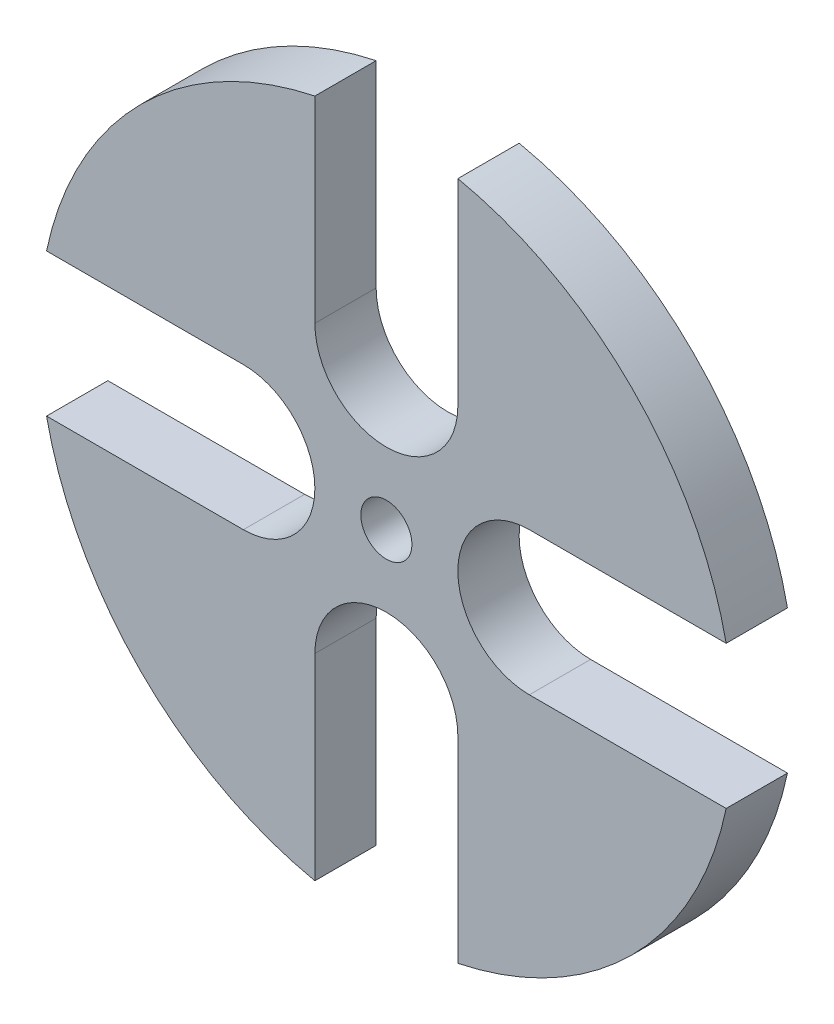
ISO-10303-21;
HEADER;
FILE_DESCRIPTION(('STEP AP214'),'2;1');
FILE_NAME('part.step','',(''),(''),'','','');
FILE_SCHEMA(('AUTOMOTIVE_DESIGN { 1 0 10303 214 1 1 1 1 }'));
ENDSEC;
DATA;
#1=APPLICATION_CONTEXT('core data for automotive mechanical design processes');
#2=APPLICATION_PROTOCOL_DEFINITION('international standard','automotive_design',2000,#1);
#3=PRODUCT_CONTEXT('',#1,'mechanical');
#4=PRODUCT('Part','Part','',(#3));
#5=PRODUCT_RELATED_PRODUCT_CATEGORY('part','',(#4));
#6=PRODUCT_DEFINITION_FORMATION('','',#4);
#7=PRODUCT_DEFINITION_CONTEXT('part definition',#1,'design');
#8=PRODUCT_DEFINITION('design','',#6,#7);
#9=PRODUCT_DEFINITION_SHAPE('','',#8);
#10=(LENGTH_UNIT() NAMED_UNIT(*) SI_UNIT(.MILLI.,.METRE.));
#11=(NAMED_UNIT(*) PLANE_ANGLE_UNIT() SI_UNIT($,.RADIAN.));
#12=(NAMED_UNIT(*) SI_UNIT($,.STERADIAN.) SOLID_ANGLE_UNIT());
#13=UNCERTAINTY_MEASURE_WITH_UNIT(LENGTH_MEASURE(1.E-05),#10,'distance_accuracy_value','');
#14=(GEOMETRIC_REPRESENTATION_CONTEXT(3) GLOBAL_UNCERTAINTY_ASSIGNED_CONTEXT((#13)) GLOBAL_UNIT_ASSIGNED_CONTEXT((#10,
#11,#12)) REPRESENTATION_CONTEXT('',''));
#15=CARTESIAN_POINT('',(0.,0.,0.));
#16=DIRECTION('',(0.,0.,1.));
#17=DIRECTION('',(1.,0.,0.));
#18=AXIS2_PLACEMENT_3D('',#15,#16,#17);
#19=CARTESIAN_POINT('',(0.,-7.,3.));
#20=DIRECTION('',(0.,0.,-1.));
#21=DIRECTION('',(-1.,0.,0.));
#22=AXIS2_PLACEMENT_3D('',#19,#20,#21);
#23=CYLINDRICAL_SURFACE('',#22,3.5);
#24=CARTESIAN_POINT('',(0.,-7.,0.));
#25=DIRECTION('',(0.,0.,1.));
#26=DIRECTION('',(1.,0.,0.));
#27=AXIS2_PLACEMENT_3D('',#24,#25,#26);
#28=CIRCLE('',#27,3.5);
#29=CARTESIAN_POINT('',(3.5,-7.,0.));
#30=VERTEX_POINT('',#29);
#31=CARTESIAN_POINT('',(-3.5,-7.,0.));
#32=VERTEX_POINT('',#31);
#33=EDGE_CURVE('E217',#30,#32,#28,.T.);
#34=ORIENTED_EDGE('',*,*,#33,.F.);
#35=DIRECTION('',(0.,0.,-1.));
#36=VECTOR('',#35,1.);
#37=CARTESIAN_POINT('',(3.5,-7.,3.));
#38=LINE('',#37,#36);
#39=CARTESIAN_POINT('',(3.5,-7.,3.));
#40=VERTEX_POINT('',#39);
#41=EDGE_CURVE('E11',#40,#30,#38,.T.);
#42=ORIENTED_EDGE('',*,*,#41,.F.);
#43=CARTESIAN_POINT('',(0.,-7.,3.));
#44=DIRECTION('',(0.,0.,1.));
#45=DIRECTION('',(1.,0.,0.));
#46=AXIS2_PLACEMENT_3D('',#43,#44,#45);
#47=CIRCLE('',#46,3.5);
#48=CARTESIAN_POINT('',(-3.5,-7.,3.));
#49=VERTEX_POINT('',#48);
#50=EDGE_CURVE('E320',#40,#49,#47,.T.);
#51=ORIENTED_EDGE('',*,*,#50,.T.);
#52=DIRECTION('',(0.,0.,-1.));
#53=VECTOR('',#52,1.);
#54=CARTESIAN_POINT('',(-3.5,-7.,3.));
#55=LINE('',#54,#53);
#56=EDGE_CURVE('E52',#49,#32,#55,.T.);
#57=ORIENTED_EDGE('',*,*,#56,.T.);
#58=EDGE_LOOP('',(#34,#42,#51,#57));
#59=FACE_BOUND('',#58,.T.);
#60=ADVANCED_FACE('F35',(#59),#23,.F.);
#61=CARTESIAN_POINT('',(3.5,0.,3.));
#62=DIRECTION('',(1.,0.,0.));
#63=DIRECTION('',(0.,0.,-1.));
#64=AXIS2_PLACEMENT_3D('',#61,#62,#63);
#65=PLANE('',#64);
#66=DIRECTION('',(0.,-1.,0.));
#67=VECTOR('',#66,1.);
#68=CARTESIAN_POINT('',(3.5,0.,0.));
#69=LINE('',#68,#67);
#70=CARTESIAN_POINT('',(3.5,-16.6358047596141,0.));
#71=VERTEX_POINT('',#70);
#72=EDGE_CURVE('E214',#30,#71,#69,.T.);
#73=ORIENTED_EDGE('',*,*,#72,.T.);
#74=DIRECTION('',(0.,0.,-1.));
#75=VECTOR('',#74,1.);
#76=CARTESIAN_POINT('',(3.5,-16.6358047596141,3.));
#77=LINE('',#76,#75);
#78=CARTESIAN_POINT('',(3.5,-16.6358047596141,3.));
#79=VERTEX_POINT('',#78);
#80=EDGE_CURVE('E44',#79,#71,#77,.T.);
#81=ORIENTED_EDGE('',*,*,#80,.F.);
#82=DIRECTION('',(0.,-1.,0.));
#83=VECTOR('',#82,1.);
#84=CARTESIAN_POINT('',(3.5,0.,3.));
#85=LINE('',#84,#83);
#86=EDGE_CURVE('E322',#40,#79,#85,.T.);
#87=ORIENTED_EDGE('',*,*,#86,.F.);
#88=ORIENTED_EDGE('',*,*,#41,.T.);
#89=EDGE_LOOP('',(#73,#81,#87,#88));
#90=FACE_BOUND('',#89,.T.);
#91=ADVANCED_FACE('F215',(#90),#65,.F.);
#92=CARTESIAN_POINT('',(0.,0.,3.));
#93=DIRECTION('',(0.,0.,-1.));
#94=DIRECTION('',(-1.,0.,0.));
#95=AXIS2_PLACEMENT_3D('',#92,#93,#94);
#96=CYLINDRICAL_SURFACE('',#95,17.);
#97=CARTESIAN_POINT('',(0.,0.,0.));
#98=DIRECTION('',(0.,0.,1.));
#99=DIRECTION('',(1.,0.,0.));
#100=AXIS2_PLACEMENT_3D('',#97,#98,#99);
#101=CIRCLE('',#100,17.);
#102=CARTESIAN_POINT('',(16.6358047596141,-3.5,0.));
#103=VERTEX_POINT('',#102);
#104=EDGE_CURVE('E209',#71,#103,#101,.T.);
#105=ORIENTED_EDGE('',*,*,#104,.T.);
#106=DIRECTION('',(0.,0.,-1.));
#107=VECTOR('',#106,1.);
#108=CARTESIAN_POINT('',(16.6358047596141,-3.5,3.));
#109=LINE('',#108,#107);
#110=CARTESIAN_POINT('',(16.6358047596141,-3.5,3.));
#111=VERTEX_POINT('',#110);
#112=EDGE_CURVE('E201',#111,#103,#109,.T.);
#113=ORIENTED_EDGE('',*,*,#112,.F.);
#114=CARTESIAN_POINT('',(0.,0.,3.));
#115=DIRECTION('',(0.,0.,1.));
#116=DIRECTION('',(1.,0.,0.));
#117=AXIS2_PLACEMENT_3D('',#114,#115,#116);
#118=CIRCLE('',#117,17.);
#119=EDGE_CURVE('E162',#79,#111,#118,.T.);
#120=ORIENTED_EDGE('',*,*,#119,.F.);
#121=ORIENTED_EDGE('',*,*,#80,.T.);
#122=EDGE_LOOP('',(#105,#113,#120,#121));
#123=FACE_BOUND('',#122,.T.);
#124=ADVANCED_FACE('F207',(#123),#96,.T.);
#125=CARTESIAN_POINT('',(0.,-3.5,3.));
#126=DIRECTION('',(0.,1.,0.));
#127=DIRECTION('',(0.,0.,1.));
#128=AXIS2_PLACEMENT_3D('',#125,#126,#127);
#129=PLANE('',#128);
#130=DIRECTION('',(1.,0.,0.));
#131=VECTOR('',#130,1.);
#132=CARTESIAN_POINT('',(0.,-3.5,0.));
#133=LINE('',#132,#131);
#134=CARTESIAN_POINT('',(7.,-3.5,0.));
#135=VERTEX_POINT('',#134);
#136=EDGE_CURVE('E219',#135,#103,#133,.T.);
#137=ORIENTED_EDGE('',*,*,#136,.F.);
#138=DIRECTION('',(0.,0.,-1.));
#139=VECTOR('',#138,1.);
#140=CARTESIAN_POINT('',(7.,-3.5,3.));
#141=LINE('',#140,#139);
#142=CARTESIAN_POINT('',(7.,-3.5,3.));
#143=VERTEX_POINT('',#142);
#144=EDGE_CURVE('E199',#143,#135,#141,.T.);
#145=ORIENTED_EDGE('',*,*,#144,.F.);
#146=DIRECTION('',(1.,0.,0.));
#147=VECTOR('',#146,1.);
#148=CARTESIAN_POINT('',(0.,-3.5,3.));
#149=LINE('',#148,#147);
#150=EDGE_CURVE('E326',#143,#111,#149,.T.);
#151=ORIENTED_EDGE('',*,*,#150,.T.);
#152=ORIENTED_EDGE('',*,*,#112,.T.);
#153=EDGE_LOOP('',(#137,#145,#151,#152));
#154=FACE_BOUND('',#153,.T.);
#155=ADVANCED_FACE('F278',(#154),#129,.T.);
#156=CARTESIAN_POINT('',(7.,0.,3.));
#157=DIRECTION('',(0.,0.,-1.));
#158=DIRECTION('',(-1.,0.,0.));
#159=AXIS2_PLACEMENT_3D('',#156,#157,#158);
#160=CYLINDRICAL_SURFACE('',#159,3.5);
#161=CARTESIAN_POINT('',(7.,0.,0.));
#162=DIRECTION('',(0.,0.,1.));
#163=DIRECTION('',(1.,0.,0.));
#164=AXIS2_PLACEMENT_3D('',#161,#162,#163);
#165=CIRCLE('',#164,3.5);
#166=CARTESIAN_POINT('',(7.,3.5,0.));
#167=VERTEX_POINT('',#166);
#168=EDGE_CURVE('E228',#167,#135,#165,.T.);
#169=ORIENTED_EDGE('',*,*,#168,.F.);
#170=DIRECTION('',(0.,0.,-1.));
#171=VECTOR('',#170,1.);
#172=CARTESIAN_POINT('',(7.,3.5,3.));
#173=LINE('',#172,#171);
#174=CARTESIAN_POINT('',(7.,3.5,3.));
#175=VERTEX_POINT('',#174);
#176=EDGE_CURVE('E197',#175,#167,#173,.T.);
#177=ORIENTED_EDGE('',*,*,#176,.F.);
#178=CARTESIAN_POINT('',(7.,0.,3.));
#179=DIRECTION('',(0.,0.,1.));
#180=DIRECTION('',(1.,0.,0.));
#181=AXIS2_PLACEMENT_3D('',#178,#179,#180);
#182=CIRCLE('',#181,3.5);
#183=EDGE_CURVE('E330',#175,#143,#182,.T.);
#184=ORIENTED_EDGE('',*,*,#183,.T.);
#185=ORIENTED_EDGE('',*,*,#144,.T.);
#186=EDGE_LOOP('',(#169,#177,#184,#185));
#187=FACE_BOUND('',#186,.T.);
#188=ADVANCED_FACE('F281',(#187),#160,.F.);
#189=CARTESIAN_POINT('',(0.,3.5,3.));
#190=DIRECTION('',(0.,1.,0.));
#191=DIRECTION('',(0.,0.,1.));
#192=AXIS2_PLACEMENT_3D('',#189,#190,#191);
#193=PLANE('',#192);
#194=DIRECTION('',(1.,0.,0.));
#195=VECTOR('',#194,1.);
#196=CARTESIAN_POINT('',(0.,3.5,0.));
#197=LINE('',#196,#195);
#198=CARTESIAN_POINT('',(16.6358047596141,3.5,0.));
#199=VERTEX_POINT('',#198);
#200=EDGE_CURVE('E231',#167,#199,#197,.T.);
#201=ORIENTED_EDGE('',*,*,#200,.T.);
#202=DIRECTION('',(0.,0.,-1.));
#203=VECTOR('',#202,1.);
#204=CARTESIAN_POINT('',(16.6358047596141,3.5,3.));
#205=LINE('',#204,#203);
#206=CARTESIAN_POINT('',(16.6358047596141,3.5,3.));
#207=VERTEX_POINT('',#206);
#208=EDGE_CURVE('E194',#207,#199,#205,.T.);
#209=ORIENTED_EDGE('',*,*,#208,.F.);
#210=DIRECTION('',(1.,0.,0.));
#211=VECTOR('',#210,1.);
#212=CARTESIAN_POINT('',(0.,3.5,3.));
#213=LINE('',#212,#211);
#214=EDGE_CURVE('E333',#175,#207,#213,.T.);
#215=ORIENTED_EDGE('',*,*,#214,.F.);
#216=ORIENTED_EDGE('',*,*,#176,.T.);
#217=EDGE_LOOP('',(#201,#209,#215,#216));
#218=FACE_BOUND('',#217,.T.);
#219=ADVANCED_FACE('F285',(#218),#193,.F.);
#220=CARTESIAN_POINT('',(3.5,16.6358047596141,0.));
#221=VERTEX_POINT('',#220);
#222=EDGE_CURVE('E222',#199,#221,#101,.T.);
#223=ORIENTED_EDGE('',*,*,#222,.T.);
#224=DIRECTION('',(0.,0.,-1.));
#225=VECTOR('',#224,1.);
#226=CARTESIAN_POINT('',(3.5,16.6358047596141,3.));
#227=LINE('',#226,#225);
#228=CARTESIAN_POINT('',(3.5,16.6358047596141,3.));
#229=VERTEX_POINT('',#228);
#230=EDGE_CURVE('E192',#229,#221,#227,.T.);
#231=ORIENTED_EDGE('',*,*,#230,.F.);
#232=EDGE_CURVE('E327',#207,#229,#118,.T.);
#233=ORIENTED_EDGE('',*,*,#232,.F.);
#234=ORIENTED_EDGE('',*,*,#208,.T.);
#235=EDGE_LOOP('',(#223,#231,#233,#234));
#236=FACE_BOUND('',#235,.T.);
#237=ADVANCED_FACE('F289',(#236),#96,.T.);
#238=CARTESIAN_POINT('',(3.5,0.,3.));
#239=DIRECTION('',(-1.,0.,0.));
#240=DIRECTION('',(0.,0.,1.));
#241=AXIS2_PLACEMENT_3D('',#238,#239,#240);
#242=PLANE('',#241);
#243=DIRECTION('',(0.,1.,0.));
#244=VECTOR('',#243,1.);
#245=CARTESIAN_POINT('',(3.5,0.,0.));
#246=LINE('',#245,#244);
#247=CARTESIAN_POINT('',(3.5,7.,0.));
#248=VERTEX_POINT('',#247);
#249=EDGE_CURVE('E234',#248,#221,#246,.T.);
#250=ORIENTED_EDGE('',*,*,#249,.F.);
#251=DIRECTION('',(0.,0.,-1.));
#252=VECTOR('',#251,1.);
#253=CARTESIAN_POINT('',(3.5,7.,3.));
#254=LINE('',#253,#252);
#255=CARTESIAN_POINT('',(3.5,7.,3.));
#256=VERTEX_POINT('',#255);
#257=EDGE_CURVE('E190',#256,#248,#254,.T.);
#258=ORIENTED_EDGE('',*,*,#257,.F.);
#259=DIRECTION('',(0.,1.,0.));
#260=VECTOR('',#259,1.);
#261=CARTESIAN_POINT('',(3.5,0.,3.));
#262=LINE('',#261,#260);
#263=EDGE_CURVE('E336',#256,#229,#262,.T.);
#264=ORIENTED_EDGE('',*,*,#263,.T.);
#265=ORIENTED_EDGE('',*,*,#230,.T.);
#266=EDGE_LOOP('',(#250,#258,#264,#265));
#267=FACE_BOUND('',#266,.T.);
#268=ADVANCED_FACE('F291',(#267),#242,.T.);
#269=CARTESIAN_POINT('',(0.,7.,3.));
#270=DIRECTION('',(0.,0.,-1.));
#271=DIRECTION('',(-1.,0.,0.));
#272=AXIS2_PLACEMENT_3D('',#269,#270,#271);
#273=CYLINDRICAL_SURFACE('',#272,3.5);
#274=CARTESIAN_POINT('',(0.,7.,0.));
#275=DIRECTION('',(0.,0.,1.));
#276=DIRECTION('',(1.,0.,0.));
#277=AXIS2_PLACEMENT_3D('',#274,#275,#276);
#278=CIRCLE('',#277,3.5);
#279=CARTESIAN_POINT('',(-3.5,7.,0.));
#280=VERTEX_POINT('',#279);
#281=EDGE_CURVE('E237',#280,#248,#278,.T.);
#282=ORIENTED_EDGE('',*,*,#281,.F.);
#283=DIRECTION('',(0.,0.,-1.));
#284=VECTOR('',#283,1.);
#285=CARTESIAN_POINT('',(-3.5,7.,3.));
#286=LINE('',#285,#284);
#287=CARTESIAN_POINT('',(-3.5,7.,3.));
#288=VERTEX_POINT('',#287);
#289=EDGE_CURVE('E188',#288,#280,#286,.T.);
#290=ORIENTED_EDGE('',*,*,#289,.F.);
#291=CARTESIAN_POINT('',(0.,7.,3.));
#292=DIRECTION('',(0.,0.,1.));
#293=DIRECTION('',(1.,0.,0.));
#294=AXIS2_PLACEMENT_3D('',#291,#292,#293);
#295=CIRCLE('',#294,3.5);
#296=EDGE_CURVE('E339',#288,#256,#295,.T.);
#297=ORIENTED_EDGE('',*,*,#296,.T.);
#298=ORIENTED_EDGE('',*,*,#257,.T.);
#299=EDGE_LOOP('',(#282,#290,#297,#298));
#300=FACE_BOUND('',#299,.T.);
#301=ADVANCED_FACE('F294',(#300),#273,.F.);
#302=CARTESIAN_POINT('',(-3.5,0.,3.));
#303=DIRECTION('',(-1.,0.,0.));
#304=DIRECTION('',(0.,0.,1.));
#305=AXIS2_PLACEMENT_3D('',#302,#303,#304);
#306=PLANE('',#305);
#307=DIRECTION('',(0.,1.,0.));
#308=VECTOR('',#307,1.);
#309=CARTESIAN_POINT('',(-3.5,0.,0.));
#310=LINE('',#309,#308);
#311=CARTESIAN_POINT('',(-3.5,16.6358047596141,0.));
#312=VERTEX_POINT('',#311);
#313=EDGE_CURVE('E240',#280,#312,#310,.T.);
#314=ORIENTED_EDGE('',*,*,#313,.T.);
#315=DIRECTION('',(0.,0.,-1.));
#316=VECTOR('',#315,1.);
#317=CARTESIAN_POINT('',(-3.5,16.6358047596141,3.));
#318=LINE('',#317,#316);
#319=CARTESIAN_POINT('',(-3.5,16.6358047596141,3.));
#320=VERTEX_POINT('',#319);
#321=EDGE_CURVE('E185',#320,#312,#318,.T.);
#322=ORIENTED_EDGE('',*,*,#321,.F.);
#323=DIRECTION('',(0.,1.,0.));
#324=VECTOR('',#323,1.);
#325=CARTESIAN_POINT('',(-3.5,0.,3.));
#326=LINE('',#325,#324);
#327=EDGE_CURVE('E342',#288,#320,#326,.T.);
#328=ORIENTED_EDGE('',*,*,#327,.F.);
#329=ORIENTED_EDGE('',*,*,#289,.T.);
#330=EDGE_LOOP('',(#314,#322,#328,#329));
#331=FACE_BOUND('',#330,.T.);
#332=ADVANCED_FACE('F298',(#331),#306,.F.);
#333=CARTESIAN_POINT('',(-16.6358047596141,3.5,0.));
#334=VERTEX_POINT('',#333);
#335=EDGE_CURVE('E243',#312,#334,#101,.T.);
#336=ORIENTED_EDGE('',*,*,#335,.T.);
#337=DIRECTION('',(0.,0.,-1.));
#338=VECTOR('',#337,1.);
#339=CARTESIAN_POINT('',(-16.6358047596141,3.5,3.));
#340=LINE('',#339,#338);
#341=CARTESIAN_POINT('',(-16.6358047596141,3.5,3.));
#342=VERTEX_POINT('',#341);
#343=EDGE_CURVE('E183',#342,#334,#340,.T.);
#344=ORIENTED_EDGE('',*,*,#343,.F.);
#345=EDGE_CURVE('E161',#320,#342,#118,.T.);
#346=ORIENTED_EDGE('',*,*,#345,.F.);
#347=ORIENTED_EDGE('',*,*,#321,.T.);
#348=EDGE_LOOP('',(#336,#344,#346,#347));
#349=FACE_BOUND('',#348,.T.);
#350=ADVANCED_FACE('F270',(#349),#96,.T.);
#351=CARTESIAN_POINT('',(0.,3.5,3.));
#352=DIRECTION('',(0.,-1.,0.));
#353=DIRECTION('',(1.,0.,0.));
#354=AXIS2_PLACEMENT_3D('',#351,#352,#353);
#355=PLANE('',#354);
#356=DIRECTION('',(-1.,0.,0.));
#357=VECTOR('',#356,1.);
#358=CARTESIAN_POINT('',(0.,3.5,0.));
#359=LINE('',#358,#357);
#360=CARTESIAN_POINT('',(-7.,3.5,0.));
#361=VERTEX_POINT('',#360);
#362=EDGE_CURVE('E244',#361,#334,#359,.T.);
#363=ORIENTED_EDGE('',*,*,#362,.F.);
#364=DIRECTION('',(0.,0.,-1.));
#365=VECTOR('',#364,1.);
#366=CARTESIAN_POINT('',(-7.,3.5,3.));
#367=LINE('',#366,#365);
#368=CARTESIAN_POINT('',(-7.,3.5,3.));
#369=VERTEX_POINT('',#368);
#370=EDGE_CURVE('E177',#369,#361,#367,.T.);
#371=ORIENTED_EDGE('',*,*,#370,.F.);
#372=DIRECTION('',(-1.,0.,0.));
#373=VECTOR('',#372,1.);
#374=CARTESIAN_POINT('',(0.,3.5,3.));
#375=LINE('',#374,#373);
#376=EDGE_CURVE('E345',#369,#342,#375,.T.);
#377=ORIENTED_EDGE('',*,*,#376,.T.);
#378=ORIENTED_EDGE('',*,*,#343,.T.);
#379=EDGE_LOOP('',(#363,#371,#377,#378));
#380=FACE_BOUND('',#379,.T.);
#381=ADVANCED_FACE('F303',(#380),#355,.T.);
#382=CARTESIAN_POINT('',(-7.,0.,3.));
#383=DIRECTION('',(0.,0.,-1.));
#384=DIRECTION('',(-1.,0.,0.));
#385=AXIS2_PLACEMENT_3D('',#382,#383,#384);
#386=CYLINDRICAL_SURFACE('',#385,3.5);
#387=CARTESIAN_POINT('',(-7.,0.,0.));
#388=DIRECTION('',(0.,0.,1.));
#389=DIRECTION('',(1.,0.,0.));
#390=AXIS2_PLACEMENT_3D('',#387,#388,#389);
#391=CIRCLE('',#390,3.5);
#392=CARTESIAN_POINT('',(-7.,-3.5,0.));
#393=VERTEX_POINT('',#392);
#394=EDGE_CURVE('E247',#393,#361,#391,.T.);
#395=ORIENTED_EDGE('',*,*,#394,.F.);
#396=DIRECTION('',(0.,0.,-1.));
#397=VECTOR('',#396,1.);
#398=CARTESIAN_POINT('',(-7.,-3.5,3.));
#399=LINE('',#398,#397);
#400=CARTESIAN_POINT('',(-7.,-3.5,3.));
#401=VERTEX_POINT('',#400);
#402=EDGE_CURVE('E175',#401,#393,#399,.T.);
#403=ORIENTED_EDGE('',*,*,#402,.F.);
#404=CARTESIAN_POINT('',(-7.,0.,3.));
#405=DIRECTION('',(0.,0.,1.));
#406=DIRECTION('',(1.,0.,0.));
#407=AXIS2_PLACEMENT_3D('',#404,#405,#406);
#408=CIRCLE('',#407,3.5);
#409=EDGE_CURVE('E169',#401,#369,#408,.T.);
#410=ORIENTED_EDGE('',*,*,#409,.T.);
#411=ORIENTED_EDGE('',*,*,#370,.T.);
#412=EDGE_LOOP('',(#395,#403,#410,#411));
#413=FACE_BOUND('',#412,.T.);
#414=ADVANCED_FACE('F306',(#413),#386,.F.);
#415=CARTESIAN_POINT('',(0.,-3.5,3.));
#416=DIRECTION('',(0.,-1.,0.));
#417=DIRECTION('',(0.,0.,-1.));
#418=AXIS2_PLACEMENT_3D('',#415,#416,#417);
#419=PLANE('',#418);
#420=DIRECTION('',(-1.,0.,0.));
#421=VECTOR('',#420,1.);
#422=CARTESIAN_POINT('',(0.,-3.5,0.));
#423=LINE('',#422,#421);
#424=CARTESIAN_POINT('',(-16.6358047596141,-3.5,0.));
#425=VERTEX_POINT('',#424);
#426=EDGE_CURVE('E174',#393,#425,#423,.T.);
#427=ORIENTED_EDGE('',*,*,#426,.T.);
#428=DIRECTION('',(0.,0.,-1.));
#429=VECTOR('',#428,1.);
#430=CARTESIAN_POINT('',(-16.6358047596141,-3.5,3.));
#431=LINE('',#430,#429);
#432=CARTESIAN_POINT('',(-16.6358047596141,-3.5,3.));
#433=VERTEX_POINT('',#432);
#434=EDGE_CURVE('E154',#433,#425,#431,.T.);
#435=ORIENTED_EDGE('',*,*,#434,.F.);
#436=DIRECTION('',(-1.,0.,0.));
#437=VECTOR('',#436,1.);
#438=CARTESIAN_POINT('',(0.,-3.5,3.));
#439=LINE('',#438,#437);
#440=EDGE_CURVE('E159',#401,#433,#439,.T.);
#441=ORIENTED_EDGE('',*,*,#440,.F.);
#442=ORIENTED_EDGE('',*,*,#402,.T.);
#443=EDGE_LOOP('',(#427,#435,#441,#442));
#444=FACE_BOUND('',#443,.T.);
#445=ADVANCED_FACE('F172',(#444),#419,.F.);
#446=CARTESIAN_POINT('',(-3.5,-16.6358047596141,0.));
#447=VERTEX_POINT('',#446);
#448=EDGE_CURVE('E221',#425,#447,#101,.T.);
#449=ORIENTED_EDGE('',*,*,#448,.T.);
#450=DIRECTION('',(0.,0.,-1.));
#451=VECTOR('',#450,1.);
#452=CARTESIAN_POINT('',(-3.5,-16.6358047596141,3.));
#453=LINE('',#452,#451);
#454=CARTESIAN_POINT('',(-3.5,-16.6358047596141,3.));
#455=VERTEX_POINT('',#454);
#456=EDGE_CURVE('E102',#455,#447,#453,.T.);
#457=ORIENTED_EDGE('',*,*,#456,.F.);
#458=EDGE_CURVE('E150',#433,#455,#118,.T.);
#459=ORIENTED_EDGE('',*,*,#458,.F.);
#460=ORIENTED_EDGE('',*,*,#434,.T.);
#461=EDGE_LOOP('',(#449,#457,#459,#460));
#462=FACE_BOUND('',#461,.T.);
#463=ADVANCED_FACE('F152',(#462),#96,.T.);
#464=CARTESIAN_POINT('',(0.,0.,3.));
#465=DIRECTION('',(0.,0.,-1.));
#466=DIRECTION('',(-1.,0.,0.));
#467=AXIS2_PLACEMENT_3D('',#464,#465,#466);
#468=CYLINDRICAL_SURFACE('',#467,1.25);
#469=CARTESIAN_POINT('',(0.,0.,3.));
#470=DIRECTION('',(0.,0.,1.));
#471=DIRECTION('',(1.,0.,0.));
#472=AXIS2_PLACEMENT_3D('',#469,#470,#471);
#473=CIRCLE('',#472,1.25);
#474=CARTESIAN_POINT('',(1.25,0.,3.));
#475=VERTEX_POINT('',#474);
#476=EDGE_CURVE('E253',#475,#475,#473,.T.);
#477=ORIENTED_EDGE('',*,*,#476,.T.);
#478=EDGE_LOOP('',(#477));
#479=FACE_BOUND('',#478,.T.);
#480=CARTESIAN_POINT('',(0.,0.,0.));
#481=DIRECTION('',(0.,0.,1.));
#482=DIRECTION('',(1.,0.,0.));
#483=AXIS2_PLACEMENT_3D('',#480,#481,#482);
#484=CIRCLE('',#483,1.25);
#485=CARTESIAN_POINT('',(1.25,0.,0.));
#486=VERTEX_POINT('',#485);
#487=EDGE_CURVE('E223',#486,#486,#484,.T.);
#488=ORIENTED_EDGE('',*,*,#487,.F.);
#489=EDGE_LOOP('',(#488));
#490=FACE_BOUND('',#489,.T.);
#491=ADVANCED_FACE('F37',(#479,#490),#468,.F.);
#492=CARTESIAN_POINT('',(-3.5,0.,3.));
#493=DIRECTION('',(1.,0.,0.));
#494=DIRECTION('',(0.,1.,0.));
#495=AXIS2_PLACEMENT_3D('',#492,#493,#494);
#496=PLANE('',#495);
#497=DIRECTION('',(0.,-1.,0.));
#498=VECTOR('',#497,1.);
#499=CARTESIAN_POINT('',(-3.5,0.,0.));
#500=LINE('',#499,#498);
#501=EDGE_CURVE('E251',#32,#447,#500,.T.);
#502=ORIENTED_EDGE('',*,*,#501,.F.);
#503=ORIENTED_EDGE('',*,*,#56,.F.);
#504=DIRECTION('',(0.,-1.,0.));
#505=VECTOR('',#504,1.);
#506=CARTESIAN_POINT('',(-3.5,0.,3.));
#507=LINE('',#506,#505);
#508=EDGE_CURVE('E158',#49,#455,#507,.T.);
#509=ORIENTED_EDGE('',*,*,#508,.T.);
#510=ORIENTED_EDGE('',*,*,#456,.T.);
#511=EDGE_LOOP('',(#502,#503,#509,#510));
#512=FACE_BOUND('',#511,.T.);
#513=ADVANCED_FACE('F262',(#512),#496,.T.);
#514=CARTESIAN_POINT('',(0.,0.,3.));
#515=DIRECTION('',(0.,0.,1.));
#516=DIRECTION('',(1.,0.,0.));
#517=AXIS2_PLACEMENT_3D('',#514,#515,#516);
#518=PLANE('',#517);
#519=ORIENTED_EDGE('',*,*,#476,.F.);
#520=EDGE_LOOP('',(#519));
#521=FACE_BOUND('',#520,.T.);
#522=ORIENTED_EDGE('',*,*,#50,.F.);
#523=ORIENTED_EDGE('',*,*,#86,.T.);
#524=ORIENTED_EDGE('',*,*,#119,.T.);
#525=ORIENTED_EDGE('',*,*,#150,.F.);
#526=ORIENTED_EDGE('',*,*,#183,.F.);
#527=ORIENTED_EDGE('',*,*,#214,.T.);
#528=ORIENTED_EDGE('',*,*,#232,.T.);
#529=ORIENTED_EDGE('',*,*,#263,.F.);
#530=ORIENTED_EDGE('',*,*,#296,.F.);
#531=ORIENTED_EDGE('',*,*,#327,.T.);
#532=ORIENTED_EDGE('',*,*,#345,.T.);
#533=ORIENTED_EDGE('',*,*,#376,.F.);
#534=ORIENTED_EDGE('',*,*,#409,.F.);
#535=ORIENTED_EDGE('',*,*,#440,.T.);
#536=ORIENTED_EDGE('',*,*,#458,.T.);
#537=ORIENTED_EDGE('',*,*,#508,.F.);
#538=EDGE_LOOP('',(#522,#523,#524,#525,#526,#527,#528,#529,#530,#531,#532,#533,#534,#535,#536,#537));
#539=FACE_BOUND('',#538,.T.);
#540=ADVANCED_FACE('F166',(#521,#539),#518,.T.);
#541=CARTESIAN_POINT('',(0.,0.,0.));
#542=DIRECTION('',(0.,0.,1.));
#543=DIRECTION('',(1.,0.,0.));
#544=AXIS2_PLACEMENT_3D('',#541,#542,#543);
#545=PLANE('',#544);
#546=ORIENTED_EDGE('',*,*,#487,.T.);
#547=EDGE_LOOP('',(#546));
#548=FACE_BOUND('',#547,.T.);
#549=ORIENTED_EDGE('',*,*,#33,.T.);
#550=ORIENTED_EDGE('',*,*,#501,.T.);
#551=ORIENTED_EDGE('',*,*,#448,.F.);
#552=ORIENTED_EDGE('',*,*,#426,.F.);
#553=ORIENTED_EDGE('',*,*,#394,.T.);
#554=ORIENTED_EDGE('',*,*,#362,.T.);
#555=ORIENTED_EDGE('',*,*,#335,.F.);
#556=ORIENTED_EDGE('',*,*,#313,.F.);
#557=ORIENTED_EDGE('',*,*,#281,.T.);
#558=ORIENTED_EDGE('',*,*,#249,.T.);
#559=ORIENTED_EDGE('',*,*,#222,.F.);
#560=ORIENTED_EDGE('',*,*,#200,.F.);
#561=ORIENTED_EDGE('',*,*,#168,.T.);
#562=ORIENTED_EDGE('',*,*,#136,.T.);
#563=ORIENTED_EDGE('',*,*,#104,.F.);
#564=ORIENTED_EDGE('',*,*,#72,.F.);
#565=EDGE_LOOP('',(#549,#550,#551,#552,#553,#554,#555,#556,#557,#558,#559,#560,#561,#562,#563,#564));
#566=FACE_BOUND('',#565,.T.);
#567=ADVANCED_FACE('F259',(#548,#566),#545,.F.);
#568=CLOSED_SHELL('',(#60,#91,#124,#155,#188,#219,#237,#268,#301,#332,#350,#381,#414,#445,#463,
#491,#513,#540,#567));
#569=MANIFOLD_SOLID_BREP('B2',#568);
#570=ADVANCED_BREP_SHAPE_REPRESENTATION('',(#18,#569),#14);
#571=SHAPE_DEFINITION_REPRESENTATION(#9,#570);
ENDSEC;
END-ISO-10303-21;
